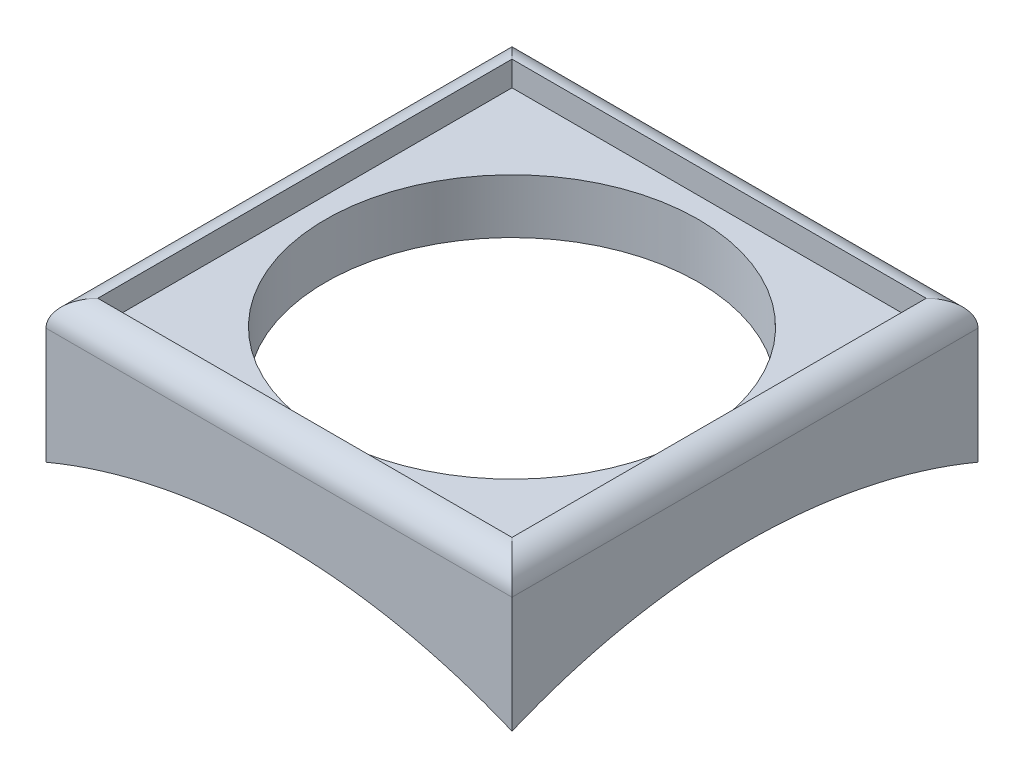
ISO-10303-21;
HEADER;
FILE_DESCRIPTION(('STEP AP214'),'2;1');
FILE_NAME('part.step','',(''),(''),'','','');
FILE_SCHEMA(('AUTOMOTIVE_DESIGN { 1 0 10303 214 1 1 1 1 }'));
ENDSEC;
DATA;
#1=APPLICATION_CONTEXT('core data for automotive mechanical design processes');
#2=APPLICATION_PROTOCOL_DEFINITION('international standard','automotive_design',2000,#1);
#3=PRODUCT_CONTEXT('',#1,'mechanical');
#4=PRODUCT('Part','Part','',(#3));
#5=PRODUCT_RELATED_PRODUCT_CATEGORY('part','',(#4));
#6=PRODUCT_DEFINITION_FORMATION('','',#4);
#7=PRODUCT_DEFINITION_CONTEXT('part definition',#1,'design');
#8=PRODUCT_DEFINITION('design','',#6,#7);
#9=PRODUCT_DEFINITION_SHAPE('','',#8);
#10=(LENGTH_UNIT() NAMED_UNIT(*) SI_UNIT(.MILLI.,.METRE.));
#11=(NAMED_UNIT(*) PLANE_ANGLE_UNIT() SI_UNIT($,.RADIAN.));
#12=(NAMED_UNIT(*) SI_UNIT($,.STERADIAN.) SOLID_ANGLE_UNIT());
#13=UNCERTAINTY_MEASURE_WITH_UNIT(LENGTH_MEASURE(1.E-05),#10,'distance_accuracy_value','');
#14=(GEOMETRIC_REPRESENTATION_CONTEXT(3) GLOBAL_UNCERTAINTY_ASSIGNED_CONTEXT((#13)) GLOBAL_UNIT_ASSIGNED_CONTEXT((#10,
#11,#12)) REPRESENTATION_CONTEXT('',''));
#15=CARTESIAN_POINT('',(0.,0.,0.));
#16=DIRECTION('',(0.,0.,1.));
#17=DIRECTION('',(1.,0.,0.));
#18=AXIS2_PLACEMENT_3D('',#15,#16,#17);
#19=CARTESIAN_POINT('',(18.75,-56.25,-18.75));
#20=DIRECTION('',(1.,0.,0.));
#21=DIRECTION('',(0.,0.,-1.));
#22=AXIS2_PLACEMENT_3D('',#19,#20,#21);
#23=PLANE('',#22);
#24=DIRECTION('',(0.,1.,0.));
#25=VECTOR('',#24,1.);
#26=CARTESIAN_POINT('',(18.75,-56.25,-18.75));
#27=LINE('',#26,#25);
#28=CARTESIAN_POINT('',(18.75,44.8279891486459,-18.75));
#29=VERTEX_POINT('',#28);
#30=CARTESIAN_POINT('',(18.75,54.1666666666667,-18.75));
#31=VERTEX_POINT('',#30);
#32=EDGE_CURVE('E148',#29,#31,#27,.T.);
#33=ORIENTED_EDGE('',*,*,#32,.T.);
#34=DIRECTION('',(0.,0.,-1.));
#35=VECTOR('',#34,1.);
#36=CARTESIAN_POINT('',(18.75,54.1666666666667,18.75));
#37=LINE('',#36,#35);
#38=CARTESIAN_POINT('',(18.75,54.1666666666667,18.75));
#39=VERTEX_POINT('',#38);
#40=EDGE_CURVE('E44',#31,#39,#37,.F.);
#41=ORIENTED_EDGE('',*,*,#40,.T.);
#42=DIRECTION('',(0.,1.,0.));
#43=VECTOR('',#42,1.);
#44=CARTESIAN_POINT('',(18.75,-56.25,18.75));
#45=LINE('',#44,#43);
#46=CARTESIAN_POINT('',(18.75,44.8279891486459,18.75));
#47=VERTEX_POINT('',#46);
#48=EDGE_CURVE('E149',#47,#39,#45,.T.);
#49=ORIENTED_EDGE('',*,*,#48,.F.);
#50=CARTESIAN_POINT('',(18.75,0.,0.));
#51=DIRECTION('',(1.,0.,0.));
#52=DIRECTION('',(0.,0.,-1.));
#53=AXIS2_PLACEMENT_3D('',#50,#51,#52);
#54=CIRCLE('',#53,48.5912657903775);
#55=EDGE_CURVE('E146',#29,#47,#54,.T.);
#56=ORIENTED_EDGE('',*,*,#55,.F.);
#57=EDGE_LOOP('',(#33,#41,#49,#56));
#58=FACE_BOUND('',#57,.T.);
#59=ADVANCED_FACE('F35',(#58),#23,.T.);
#60=CARTESIAN_POINT('',(-18.75,-56.25,18.75));
#61=DIRECTION('',(0.,0.,1.));
#62=DIRECTION('',(1.,0.,0.));
#63=AXIS2_PLACEMENT_3D('',#60,#61,#62);
#64=PLANE('',#63);
#65=ORIENTED_EDGE('',*,*,#48,.T.);
#66=DIRECTION('',(1.,0.,0.));
#67=VECTOR('',#66,1.);
#68=CARTESIAN_POINT('',(-18.75,54.1666666666667,18.75));
#69=LINE('',#68,#67);
#70=CARTESIAN_POINT('',(-18.75,54.1666666666667,18.75));
#71=VERTEX_POINT('',#70);
#72=EDGE_CURVE('E11',#39,#71,#69,.F.);
#73=ORIENTED_EDGE('',*,*,#72,.T.);
#74=DIRECTION('',(0.,1.,0.));
#75=VECTOR('',#74,1.);
#76=CARTESIAN_POINT('',(-18.75,-56.25,18.75));
#77=LINE('',#76,#75);
#78=CARTESIAN_POINT('',(-18.75,44.8279891486459,18.75));
#79=VERTEX_POINT('',#78);
#80=EDGE_CURVE('E152',#79,#71,#77,.T.);
#81=ORIENTED_EDGE('',*,*,#80,.F.);
#82=CARTESIAN_POINT('',(0.,0.,18.75));
#83=DIRECTION('',(0.,0.,1.));
#84=DIRECTION('',(1.,0.,0.));
#85=AXIS2_PLACEMENT_3D('',#82,#83,#84);
#86=CIRCLE('',#85,48.5912657903775);
#87=EDGE_CURVE('E144',#47,#79,#86,.T.);
#88=ORIENTED_EDGE('',*,*,#87,.F.);
#89=EDGE_LOOP('',(#65,#73,#81,#88));
#90=FACE_BOUND('',#89,.T.);
#91=ADVANCED_FACE('F192',(#90),#64,.T.);
#92=CARTESIAN_POINT('',(-18.75,-56.25,-18.75));
#93=DIRECTION('',(-1.,0.,0.));
#94=DIRECTION('',(0.,0.,1.));
#95=AXIS2_PLACEMENT_3D('',#92,#93,#94);
#96=PLANE('',#95);
#97=ORIENTED_EDGE('',*,*,#80,.T.);
#98=DIRECTION('',(0.,0.,1.));
#99=VECTOR('',#98,1.);
#100=CARTESIAN_POINT('',(-18.75,54.1666666666667,-18.75));
#101=LINE('',#100,#99);
#102=CARTESIAN_POINT('',(-18.75,54.1666666666667,-18.75));
#103=VERTEX_POINT('',#102);
#104=EDGE_CURVE('E168',#71,#103,#101,.F.);
#105=ORIENTED_EDGE('',*,*,#104,.T.);
#106=DIRECTION('',(0.,1.,0.));
#107=VECTOR('',#106,1.);
#108=CARTESIAN_POINT('',(-18.75,-56.25,-18.75));
#109=LINE('',#108,#107);
#110=CARTESIAN_POINT('',(-18.75,44.8279891486459,-18.75));
#111=VERTEX_POINT('',#110);
#112=EDGE_CURVE('E155',#111,#103,#109,.T.);
#113=ORIENTED_EDGE('',*,*,#112,.F.);
#114=CARTESIAN_POINT('',(-18.75,0.,0.));
#115=DIRECTION('',(-1.,0.,0.));
#116=DIRECTION('',(0.,0.,1.));
#117=AXIS2_PLACEMENT_3D('',#114,#115,#116);
#118=CIRCLE('',#117,48.5912657903775);
#119=EDGE_CURVE('E142',#79,#111,#118,.T.);
#120=ORIENTED_EDGE('',*,*,#119,.F.);
#121=EDGE_LOOP('',(#97,#105,#113,#120));
#122=FACE_BOUND('',#121,.T.);
#123=ADVANCED_FACE('F197',(#122),#96,.T.);
#124=CARTESIAN_POINT('',(-18.75,-56.25,-18.75));
#125=DIRECTION('',(0.,0.,-1.));
#126=DIRECTION('',(-1.,0.,0.));
#127=AXIS2_PLACEMENT_3D('',#124,#125,#126);
#128=PLANE('',#127);
#129=ORIENTED_EDGE('',*,*,#112,.T.);
#130=DIRECTION('',(-1.,0.,0.));
#131=VECTOR('',#130,1.);
#132=CARTESIAN_POINT('',(18.75,54.1666666666667,-18.75));
#133=LINE('',#132,#131);
#134=EDGE_CURVE('E59',#103,#31,#133,.F.);
#135=ORIENTED_EDGE('',*,*,#134,.T.);
#136=ORIENTED_EDGE('',*,*,#32,.F.);
#137=CARTESIAN_POINT('',(0.,0.,-18.75));
#138=DIRECTION('',(0.,0.,-1.));
#139=DIRECTION('',(-1.,0.,0.));
#140=AXIS2_PLACEMENT_3D('',#137,#138,#139);
#141=CIRCLE('',#140,48.5912657903775);
#142=EDGE_CURVE('E151',#111,#29,#141,.T.);
#143=ORIENTED_EDGE('',*,*,#142,.F.);
#144=EDGE_LOOP('',(#129,#135,#136,#143));
#145=FACE_BOUND('',#144,.T.);
#146=ADVANCED_FACE('F223',(#145),#128,.T.);
#147=CARTESIAN_POINT('',(0.,0.,0.));
#148=DIRECTION('',(0.,1.,0.));
#149=DIRECTION('',(1.,0.,0.));
#150=AXIS2_PLACEMENT_3D('',#147,#148,#149);
#151=SPHERICAL_SURFACE('',#150,52.0833333333333);
#152=CARTESIAN_POINT('',(0.,49.8765837955158,0.));
#153=DIRECTION('',(0.,-1.,0.));
#154=DIRECTION('',(0.,0.,-1.));
#155=AXIS2_PLACEMENT_3D('',#152,#153,#154);
#156=CIRCLE('',#155,15.);
#157=CARTESIAN_POINT('',(0.,49.8765837955158,-15.));
#158=VERTEX_POINT('',#157);
#159=EDGE_CURVE('E127',#158,#158,#156,.F.);
#160=ORIENTED_EDGE('',*,*,#159,.T.);
#161=EDGE_LOOP('',(#160));
#162=FACE_BOUND('',#161,.T.);
#163=ORIENTED_EDGE('',*,*,#55,.T.);
#164=ORIENTED_EDGE('',*,*,#87,.T.);
#165=ORIENTED_EDGE('',*,*,#119,.T.);
#166=ORIENTED_EDGE('',*,*,#142,.T.);
#167=EDGE_LOOP('',(#163,#164,#165,#166));
#168=FACE_BOUND('',#167,.T.);
#169=ADVANCED_FACE('F232',(#162,#168),#151,.F.);
#170=CARTESIAN_POINT('',(16.6666666666667,54.1666666666667,56.25));
#171=DIRECTION('',(0.,0.,1.));
#172=DIRECTION('',(1.,0.,0.));
#173=AXIS2_PLACEMENT_3D('',#170,#171,#172);
#174=CYLINDRICAL_SURFACE('',#173,2.08333333333333);
#175=CARTESIAN_POINT('',(16.6666666666667,54.1666666666667,16.6666666666667));
#176=DIRECTION('',(-0.707106781186547,0.,0.707106781186548));
#177=DIRECTION('',(-0.707106781186548,0.,-0.707106781186547));
#178=AXIS2_PLACEMENT_3D('',#175,#176,#177);
#179=ELLIPSE('',#178,2.94627825494395,2.08333333333333);
#180=CARTESIAN_POINT('',(16.6666666666667,56.25,16.6666666666667));
#181=VERTEX_POINT('',#180);
#182=EDGE_CURVE('E176',#39,#181,#179,.T.);
#183=ORIENTED_EDGE('',*,*,#182,.F.);
#184=ORIENTED_EDGE('',*,*,#40,.F.);
#185=CARTESIAN_POINT('',(16.6666666666667,54.1666666666667,-16.6666666666667));
#186=DIRECTION('',(0.707106781186548,0.,0.707106781186547));
#187=DIRECTION('',(-0.707106781186547,0.,0.707106781186548));
#188=AXIS2_PLACEMENT_3D('',#185,#186,#187);
#189=ELLIPSE('',#188,2.94627825494395,2.08333333333333);
#190=CARTESIAN_POINT('',(16.6666666666667,56.25,-16.6666666666667));
#191=VERTEX_POINT('',#190);
#192=EDGE_CURVE('E39',#191,#31,#189,.F.);
#193=ORIENTED_EDGE('',*,*,#192,.F.);
#194=DIRECTION('',(0.,0.,-1.));
#195=VECTOR('',#194,1.);
#196=CARTESIAN_POINT('',(16.6666666666667,56.25,-18.75));
#197=LINE('',#196,#195);
#198=EDGE_CURVE('E110',#181,#191,#197,.T.);
#199=ORIENTED_EDGE('',*,*,#198,.F.);
#200=EDGE_LOOP('',(#183,#184,#193,#199));
#201=FACE_BOUND('',#200,.T.);
#202=ADVANCED_FACE('F37',(#201),#174,.T.);
#203=CARTESIAN_POINT('',(-56.25,54.1666666666667,-16.6666666666667));
#204=DIRECTION('',(1.,0.,0.));
#205=DIRECTION('',(0.,0.,-1.));
#206=AXIS2_PLACEMENT_3D('',#203,#204,#205);
#207=CYLINDRICAL_SURFACE('',#206,2.08333333333333);
#208=ORIENTED_EDGE('',*,*,#192,.T.);
#209=ORIENTED_EDGE('',*,*,#134,.F.);
#210=CARTESIAN_POINT('',(-16.6666666666667,54.1666666666667,-16.6666666666667));
#211=DIRECTION('',(0.707106781186547,0.,-0.707106781186548));
#212=DIRECTION('',(0.707106781186547,0.,0.707106781186547));
#213=AXIS2_PLACEMENT_3D('',#210,#211,#212);
#214=ELLIPSE('',#213,2.94627825494395,2.08333333333333);
#215=CARTESIAN_POINT('',(-16.6666666666667,56.25,-16.6666666666667));
#216=VERTEX_POINT('',#215);
#217=EDGE_CURVE('E175',#216,#103,#214,.F.);
#218=ORIENTED_EDGE('',*,*,#217,.F.);
#219=DIRECTION('',(-1.,0.,0.));
#220=VECTOR('',#219,1.);
#221=CARTESIAN_POINT('',(-18.75,56.25,-16.6666666666667));
#222=LINE('',#221,#220);
#223=EDGE_CURVE('E163',#191,#216,#222,.T.);
#224=ORIENTED_EDGE('',*,*,#223,.F.);
#225=EDGE_LOOP('',(#208,#209,#218,#224));
#226=FACE_BOUND('',#225,.T.);
#227=ADVANCED_FACE('F185',(#226),#207,.T.);
#228=CARTESIAN_POINT('',(-56.25,54.1666666666667,16.6666666666667));
#229=DIRECTION('',(-1.,0.,0.));
#230=DIRECTION('',(0.,0.,1.));
#231=AXIS2_PLACEMENT_3D('',#228,#229,#230);
#232=CYLINDRICAL_SURFACE('',#231,2.08333333333333);
#233=ORIENTED_EDGE('',*,*,#182,.T.);
#234=DIRECTION('',(1.,0.,0.));
#235=VECTOR('',#234,1.);
#236=CARTESIAN_POINT('',(18.75,56.25,16.6666666666667));
#237=LINE('',#236,#235);
#238=CARTESIAN_POINT('',(-16.6666666666667,56.25,16.6666666666667));
#239=VERTEX_POINT('',#238);
#240=EDGE_CURVE('E159',#239,#181,#237,.T.);
#241=ORIENTED_EDGE('',*,*,#240,.F.);
#242=CARTESIAN_POINT('',(-16.6666666666667,54.1666666666667,16.6666666666667));
#243=DIRECTION('',(-0.707106781186547,0.,-0.707106781186547));
#244=DIRECTION('',(-0.707106781186547,0.,0.707106781186548));
#245=AXIS2_PLACEMENT_3D('',#242,#243,#244);
#246=ELLIPSE('',#245,2.94627825494395,2.08333333333333);
#247=EDGE_CURVE('E138',#71,#239,#246,.T.);
#248=ORIENTED_EDGE('',*,*,#247,.F.);
#249=ORIENTED_EDGE('',*,*,#72,.F.);
#250=EDGE_LOOP('',(#233,#241,#248,#249));
#251=FACE_BOUND('',#250,.T.);
#252=ADVANCED_FACE('F189',(#251),#232,.T.);
#253=CARTESIAN_POINT('',(-16.6666666666667,54.1666666666667,56.25));
#254=DIRECTION('',(0.,0.,-1.));
#255=DIRECTION('',(-1.,0.,0.));
#256=AXIS2_PLACEMENT_3D('',#253,#254,#255);
#257=CYLINDRICAL_SURFACE('',#256,2.08333333333333);
#258=ORIENTED_EDGE('',*,*,#217,.T.);
#259=ORIENTED_EDGE('',*,*,#104,.F.);
#260=ORIENTED_EDGE('',*,*,#247,.T.);
#261=DIRECTION('',(0.,0.,1.));
#262=VECTOR('',#261,1.);
#263=CARTESIAN_POINT('',(-16.6666666666667,56.25,18.75));
#264=LINE('',#263,#262);
#265=EDGE_CURVE('E165',#216,#239,#264,.T.);
#266=ORIENTED_EDGE('',*,*,#265,.F.);
#267=EDGE_LOOP('',(#258,#259,#260,#266));
#268=FACE_BOUND('',#267,.T.);
#269=ADVANCED_FACE('F200',(#268),#257,.T.);
#270=CARTESIAN_POINT('',(16.6666666666667,54.25,-16.6666666666667));
#271=DIRECTION('',(1.,0.,0.));
#272=DIRECTION('',(0.,0.,-1.));
#273=AXIS2_PLACEMENT_3D('',#270,#271,#272);
#274=PLANE('',#273);
#275=ORIENTED_EDGE('',*,*,#198,.T.);
#276=DIRECTION('',(0.,1.,0.));
#277=VECTOR('',#276,1.);
#278=CARTESIAN_POINT('',(16.6666666666667,54.25,-16.6666666666667));
#279=LINE('',#278,#277);
#280=CARTESIAN_POINT('',(16.6666666666667,54.25,-16.6666666666667));
#281=VERTEX_POINT('',#280);
#282=EDGE_CURVE('E103',#281,#191,#279,.T.);
#283=ORIENTED_EDGE('',*,*,#282,.F.);
#284=DIRECTION('',(0.,0.,-1.));
#285=VECTOR('',#284,1.);
#286=CARTESIAN_POINT('',(16.6666666666667,54.25,-16.6666666666667));
#287=LINE('',#286,#285);
#288=CARTESIAN_POINT('',(16.6666666666667,54.25,16.6666666666667));
#289=VERTEX_POINT('',#288);
#290=EDGE_CURVE('E107',#289,#281,#287,.T.);
#291=ORIENTED_EDGE('',*,*,#290,.F.);
#292=DIRECTION('',(0.,1.,0.));
#293=VECTOR('',#292,1.);
#294=CARTESIAN_POINT('',(16.6666666666667,54.25,16.6666666666667));
#295=LINE('',#294,#293);
#296=EDGE_CURVE('E136',#289,#181,#295,.T.);
#297=ORIENTED_EDGE('',*,*,#296,.T.);
#298=EDGE_LOOP('',(#275,#283,#291,#297));
#299=FACE_BOUND('',#298,.T.);
#300=ADVANCED_FACE('F105',(#299),#274,.F.);
#301=CARTESIAN_POINT('',(-16.6666666666667,54.25,16.6666666666667));
#302=DIRECTION('',(0.,0.,1.));
#303=DIRECTION('',(1.,0.,0.));
#304=AXIS2_PLACEMENT_3D('',#301,#302,#303);
#305=PLANE('',#304);
#306=ORIENTED_EDGE('',*,*,#240,.T.);
#307=ORIENTED_EDGE('',*,*,#296,.F.);
#308=DIRECTION('',(1.,0.,0.));
#309=VECTOR('',#308,1.);
#310=CARTESIAN_POINT('',(-16.6666666666667,54.25,16.6666666666667));
#311=LINE('',#310,#309);
#312=CARTESIAN_POINT('',(-16.6666666666667,54.25,16.6666666666667));
#313=VERTEX_POINT('',#312);
#314=EDGE_CURVE('E114',#313,#289,#311,.T.);
#315=ORIENTED_EDGE('',*,*,#314,.F.);
#316=DIRECTION('',(0.,1.,0.));
#317=VECTOR('',#316,1.);
#318=CARTESIAN_POINT('',(-16.6666666666667,54.25,16.6666666666667));
#319=LINE('',#318,#317);
#320=EDGE_CURVE('E139',#313,#239,#319,.T.);
#321=ORIENTED_EDGE('',*,*,#320,.T.);
#322=EDGE_LOOP('',(#306,#307,#315,#321));
#323=FACE_BOUND('',#322,.T.);
#324=ADVANCED_FACE('F205',(#323),#305,.F.);
#325=CARTESIAN_POINT('',(-16.6666666666667,54.25,-16.6666666666667));
#326=DIRECTION('',(-1.,0.,0.));
#327=DIRECTION('',(0.,0.,1.));
#328=AXIS2_PLACEMENT_3D('',#325,#326,#327);
#329=PLANE('',#328);
#330=ORIENTED_EDGE('',*,*,#265,.T.);
#331=ORIENTED_EDGE('',*,*,#320,.F.);
#332=DIRECTION('',(0.,0.,1.));
#333=VECTOR('',#332,1.);
#334=CARTESIAN_POINT('',(-16.6666666666667,54.25,-16.6666666666667));
#335=LINE('',#334,#333);
#336=CARTESIAN_POINT('',(-16.6666666666667,54.25,-16.6666666666667));
#337=VERTEX_POINT('',#336);
#338=EDGE_CURVE('E123',#337,#313,#335,.T.);
#339=ORIENTED_EDGE('',*,*,#338,.F.);
#340=DIRECTION('',(0.,1.,0.));
#341=VECTOR('',#340,1.);
#342=CARTESIAN_POINT('',(-16.6666666666667,54.25,-16.6666666666667));
#343=LINE('',#342,#341);
#344=EDGE_CURVE('E113',#337,#216,#343,.T.);
#345=ORIENTED_EDGE('',*,*,#344,.T.);
#346=EDGE_LOOP('',(#330,#331,#339,#345));
#347=FACE_BOUND('',#346,.T.);
#348=ADVANCED_FACE('F203',(#347),#329,.F.);
#349=CARTESIAN_POINT('',(-16.6666666666667,54.25,-16.6666666666667));
#350=DIRECTION('',(0.,0.,-1.));
#351=DIRECTION('',(-1.,0.,0.));
#352=AXIS2_PLACEMENT_3D('',#349,#350,#351);
#353=PLANE('',#352);
#354=ORIENTED_EDGE('',*,*,#223,.T.);
#355=ORIENTED_EDGE('',*,*,#344,.F.);
#356=DIRECTION('',(-1.,0.,0.));
#357=VECTOR('',#356,1.);
#358=CARTESIAN_POINT('',(-16.6666666666667,54.25,-16.6666666666667));
#359=LINE('',#358,#357);
#360=EDGE_CURVE('E117',#281,#337,#359,.T.);
#361=ORIENTED_EDGE('',*,*,#360,.F.);
#362=ORIENTED_EDGE('',*,*,#282,.T.);
#363=EDGE_LOOP('',(#354,#355,#361,#362));
#364=FACE_BOUND('',#363,.T.);
#365=ADVANCED_FACE('F118',(#364),#353,.F.);
#366=CARTESIAN_POINT('',(0.,54.25,0.));
#367=DIRECTION('',(0.,1.,0.));
#368=DIRECTION('',(0.,0.,1.));
#369=AXIS2_PLACEMENT_3D('',#366,#367,#368);
#370=PLANE('',#369);
#371=CARTESIAN_POINT('',(0.,54.25,0.));
#372=DIRECTION('',(0.,1.,0.));
#373=DIRECTION('',(0.,0.,1.));
#374=AXIS2_PLACEMENT_3D('',#371,#372,#373);
#375=CIRCLE('',#374,15.);
#376=CARTESIAN_POINT('',(0.,54.25,15.));
#377=VERTEX_POINT('',#376);
#378=EDGE_CURVE('E130',#377,#377,#375,.T.);
#379=ORIENTED_EDGE('',*,*,#378,.F.);
#380=EDGE_LOOP('',(#379));
#381=FACE_BOUND('',#380,.T.);
#382=ORIENTED_EDGE('',*,*,#290,.T.);
#383=ORIENTED_EDGE('',*,*,#360,.T.);
#384=ORIENTED_EDGE('',*,*,#338,.T.);
#385=ORIENTED_EDGE('',*,*,#314,.T.);
#386=EDGE_LOOP('',(#382,#383,#384,#385));
#387=FACE_BOUND('',#386,.T.);
#388=ADVANCED_FACE('F125',(#381,#387),#370,.T.);
#389=CARTESIAN_POINT('',(0.,48.25,0.));
#390=DIRECTION('',(0.,1.,0.));
#391=DIRECTION('',(0.,0.,1.));
#392=AXIS2_PLACEMENT_3D('',#389,#390,#391);
#393=CYLINDRICAL_SURFACE('',#392,15.);
#394=ORIENTED_EDGE('',*,*,#378,.T.);
#395=EDGE_LOOP('',(#394));
#396=FACE_BOUND('',#395,.T.);
#397=ORIENTED_EDGE('',*,*,#159,.F.);
#398=EDGE_LOOP('',(#397));
#399=FACE_BOUND('',#398,.T.);
#400=ADVANCED_FACE('F308',(#396,#399),#393,.F.);
#401=CLOSED_SHELL('',(#59,#91,#123,#146,#169,#202,#227,#252,#269,#300,#324,#348,#365,#388,#400));
#402=MANIFOLD_SOLID_BREP('B2',#401);
#403=ADVANCED_BREP_SHAPE_REPRESENTATION('',(#18,#402),#14);
#404=SHAPE_DEFINITION_REPRESENTATION(#9,#403);
ENDSEC;
END-ISO-10303-21;
